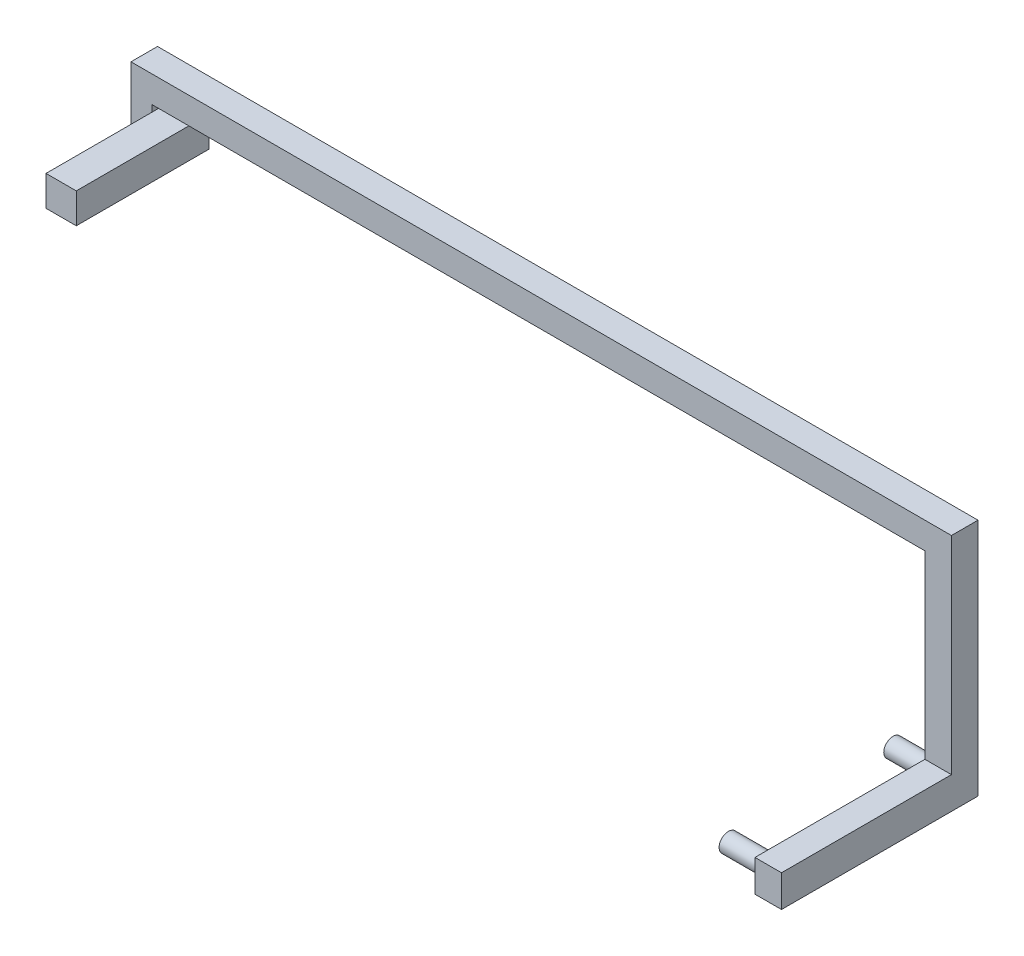
ISO-10303-21;
HEADER;
FILE_DESCRIPTION(('STEP AP214'),'2;1');
FILE_NAME('part.step','',(''),(''),'','','');
FILE_SCHEMA(('AUTOMOTIVE_DESIGN { 1 0 10303 214 1 1 1 1 }'));
ENDSEC;
DATA;
#1=APPLICATION_CONTEXT('core data for automotive mechanical design processes');
#2=APPLICATION_PROTOCOL_DEFINITION('international standard','automotive_design',2000,#1);
#3=PRODUCT_CONTEXT('',#1,'mechanical');
#4=PRODUCT('Part','Part','',(#3));
#5=PRODUCT_RELATED_PRODUCT_CATEGORY('part','',(#4));
#6=PRODUCT_DEFINITION_FORMATION('','',#4);
#7=PRODUCT_DEFINITION_CONTEXT('part definition',#1,'design');
#8=PRODUCT_DEFINITION('design','',#6,#7);
#9=PRODUCT_DEFINITION_SHAPE('','',#8);
#10=(LENGTH_UNIT() NAMED_UNIT(*) SI_UNIT(.MILLI.,.METRE.));
#11=(NAMED_UNIT(*) PLANE_ANGLE_UNIT() SI_UNIT($,.RADIAN.));
#12=(NAMED_UNIT(*) SI_UNIT($,.STERADIAN.) SOLID_ANGLE_UNIT());
#13=UNCERTAINTY_MEASURE_WITH_UNIT(LENGTH_MEASURE(1.E-05),#10,'distance_accuracy_value','');
#14=(GEOMETRIC_REPRESENTATION_CONTEXT(3) GLOBAL_UNCERTAINTY_ASSIGNED_CONTEXT((#13)) GLOBAL_UNIT_ASSIGNED_CONTEXT((#10,
#11,#12)) REPRESENTATION_CONTEXT('',''));
#15=CARTESIAN_POINT('',(0.,0.,0.));
#16=DIRECTION('',(0.,0.,1.));
#17=DIRECTION('',(1.,0.,0.));
#18=AXIS2_PLACEMENT_3D('',#15,#16,#17);
#19=CARTESIAN_POINT('',(0.,0.,5.));
#20=DIRECTION('',(0.,0.,-1.));
#21=DIRECTION('',(-1.,0.,0.));
#22=AXIS2_PLACEMENT_3D('',#19,#20,#21);
#23=PLANE('',#22);
#24=DIRECTION('',(-1.,0.,0.));
#25=VECTOR('',#24,1.);
#26=CARTESIAN_POINT('',(145.5,-27.1,5.));
#27=LINE('',#26,#25);
#28=CARTESIAN_POINT('',(150.5,-27.1,5.));
#29=VERTEX_POINT('',#28);
#30=CARTESIAN_POINT('',(145.5,-27.1,5.));
#31=VERTEX_POINT('',#30);
#32=EDGE_CURVE('E118',#29,#31,#27,.T.);
#33=ORIENTED_EDGE('',*,*,#32,.F.);
#34=DIRECTION('',(0.,1.,0.));
#35=VECTOR('',#34,1.);
#36=CARTESIAN_POINT('',(150.5,6.9,5.));
#37=LINE('',#36,#35);
#38=CARTESIAN_POINT('',(150.5,11.9,5.));
#39=VERTEX_POINT('',#38);
#40=EDGE_CURVE('E112',#29,#39,#37,.T.);
#41=ORIENTED_EDGE('',*,*,#40,.T.);
#42=DIRECTION('',(-1.,0.,0.));
#43=VECTOR('',#42,1.);
#44=CARTESIAN_POINT('',(5.5,11.9,5.));
#45=LINE('',#44,#43);
#46=CARTESIAN_POINT('',(-4.,11.9,5.));
#47=VERTEX_POINT('',#46);
#48=EDGE_CURVE('E115',#39,#47,#45,.T.);
#49=ORIENTED_EDGE('',*,*,#48,.T.);
#50=DIRECTION('',(0.,-1.,0.));
#51=VECTOR('',#50,1.);
#52=CARTESIAN_POINT('',(-4.,0.,5.));
#53=LINE('',#52,#51);
#54=CARTESIAN_POINT('',(-4.,0.,5.));
#55=VERTEX_POINT('',#54);
#56=EDGE_CURVE('E56',#47,#55,#53,.T.);
#57=ORIENTED_EDGE('',*,*,#56,.T.);
#58=DIRECTION('',(1.,0.,0.));
#59=VECTOR('',#58,1.);
#60=CARTESIAN_POINT('',(0.,0.,5.));
#61=LINE('',#60,#59);
#62=CARTESIAN_POINT('',(0.,0.,5.));
#63=VERTEX_POINT('',#62);
#64=EDGE_CURVE('E161',#55,#63,#61,.T.);
#65=ORIENTED_EDGE('',*,*,#64,.T.);
#66=DIRECTION('',(0.,-1.,0.));
#67=VECTOR('',#66,1.);
#68=CARTESIAN_POINT('',(0.,5.7,5.));
#69=LINE('',#68,#67);
#70=CARTESIAN_POINT('',(0.,5.7,5.));
#71=VERTEX_POINT('',#70);
#72=EDGE_CURVE('E102',#71,#63,#69,.T.);
#73=ORIENTED_EDGE('',*,*,#72,.F.);
#74=DIRECTION('',(0.,1.,0.));
#75=VECTOR('',#74,1.);
#76=CARTESIAN_POINT('',(0.,5.7,5.));
#77=LINE('',#76,#75);
#78=CARTESIAN_POINT('',(0.,6.9,5.));
#79=VERTEX_POINT('',#78);
#80=EDGE_CURVE('E216',#71,#79,#77,.T.);
#81=ORIENTED_EDGE('',*,*,#80,.T.);
#82=DIRECTION('',(1.,0.,0.));
#83=VECTOR('',#82,1.);
#84=CARTESIAN_POINT('',(0.,6.9,5.));
#85=LINE('',#84,#83);
#86=CARTESIAN_POINT('',(145.5,6.9,5.));
#87=VERTEX_POINT('',#86);
#88=EDGE_CURVE('E218',#79,#87,#85,.T.);
#89=ORIENTED_EDGE('',*,*,#88,.T.);
#90=DIRECTION('',(0.,-1.,0.));
#91=VECTOR('',#90,1.);
#92=CARTESIAN_POINT('',(145.5,6.9,5.));
#93=LINE('',#92,#91);
#94=EDGE_CURVE('E48',#87,#31,#93,.T.);
#95=ORIENTED_EDGE('',*,*,#94,.T.);
#96=EDGE_LOOP('',(#33,#41,#49,#57,#65,#73,#81,#89,#95));
#97=FACE_BOUND('',#96,.T.);
#98=ADVANCED_FACE('F33',(#97),#23,.F.);
#99=CARTESIAN_POINT('',(0.,0.,5.));
#100=DIRECTION('',(0.,1.,0.));
#101=DIRECTION('',(0.,0.,1.));
#102=AXIS2_PLACEMENT_3D('',#99,#100,#101);
#103=PLANE('',#102);
#104=DIRECTION('',(1.,0.,0.));
#105=VECTOR('',#104,1.);
#106=CARTESIAN_POINT('',(0.,0.,0.));
#107=LINE('',#106,#105);
#108=CARTESIAN_POINT('',(-4.,0.,0.));
#109=VERTEX_POINT('',#108);
#110=CARTESIAN_POINT('',(5.7,0.,0.));
#111=VERTEX_POINT('',#110);
#112=EDGE_CURVE('E95',#109,#111,#107,.T.);
#113=ORIENTED_EDGE('',*,*,#112,.T.);
#114=DIRECTION('',(0.,0.,-1.));
#115=VECTOR('',#114,1.);
#116=CARTESIAN_POINT('',(5.7,0.,5.));
#117=LINE('',#116,#115);
#118=CARTESIAN_POINT('',(5.7,0.,25.));
#119=VERTEX_POINT('',#118);
#120=EDGE_CURVE('E181',#119,#111,#117,.T.);
#121=ORIENTED_EDGE('',*,*,#120,.F.);
#122=DIRECTION('',(-1.,0.,0.));
#123=VECTOR('',#122,1.);
#124=CARTESIAN_POINT('',(5.7,0.,25.));
#125=LINE('',#124,#123);
#126=CARTESIAN_POINT('',(0.,0.,25.));
#127=VERTEX_POINT('',#126);
#128=EDGE_CURVE('E243',#119,#127,#125,.T.);
#129=ORIENTED_EDGE('',*,*,#128,.T.);
#130=DIRECTION('',(0.,0.,-1.));
#131=VECTOR('',#130,1.);
#132=CARTESIAN_POINT('',(0.,0.,25.));
#133=LINE('',#132,#131);
#134=EDGE_CURVE('E215',#127,#63,#133,.T.);
#135=ORIENTED_EDGE('',*,*,#134,.T.);
#136=ORIENTED_EDGE('',*,*,#64,.F.);
#137=DIRECTION('',(0.,0.,-1.));
#138=VECTOR('',#137,1.);
#139=CARTESIAN_POINT('',(-4.,0.,5.));
#140=LINE('',#139,#138);
#141=EDGE_CURVE('E136',#55,#109,#140,.T.);
#142=ORIENTED_EDGE('',*,*,#141,.T.);
#143=EDGE_LOOP('',(#113,#121,#129,#135,#136,#142));
#144=FACE_BOUND('',#143,.T.);
#145=ADVANCED_FACE('F35',(#144),#103,.F.);
#146=CARTESIAN_POINT('',(5.7,0.,5.));
#147=DIRECTION('',(-1.,0.,0.));
#148=DIRECTION('',(0.,0.,1.));
#149=AXIS2_PLACEMENT_3D('',#146,#147,#148);
#150=PLANE('',#149);
#151=DIRECTION('',(0.,1.,0.));
#152=VECTOR('',#151,1.);
#153=CARTESIAN_POINT('',(5.7,0.,0.));
#154=LINE('',#153,#152);
#155=CARTESIAN_POINT('',(5.7,5.7,0.));
#156=VERTEX_POINT('',#155);
#157=EDGE_CURVE('E141',#111,#156,#154,.T.);
#158=ORIENTED_EDGE('',*,*,#157,.T.);
#159=DIRECTION('',(0.,0.,-1.));
#160=VECTOR('',#159,1.);
#161=CARTESIAN_POINT('',(5.7,5.7,5.));
#162=LINE('',#161,#160);
#163=CARTESIAN_POINT('',(5.7,5.7,25.));
#164=VERTEX_POINT('',#163);
#165=EDGE_CURVE('E178',#164,#156,#162,.T.);
#166=ORIENTED_EDGE('',*,*,#165,.F.);
#167=DIRECTION('',(0.,-1.,0.));
#168=VECTOR('',#167,1.);
#169=CARTESIAN_POINT('',(5.7,5.7,25.));
#170=LINE('',#169,#168);
#171=EDGE_CURVE('E251',#164,#119,#170,.T.);
#172=ORIENTED_EDGE('',*,*,#171,.T.);
#173=ORIENTED_EDGE('',*,*,#120,.T.);
#174=EDGE_LOOP('',(#158,#166,#172,#173));
#175=FACE_BOUND('',#174,.T.);
#176=ADVANCED_FACE('F276',(#175),#150,.F.);
#177=CARTESIAN_POINT('',(0.,5.7,5.));
#178=DIRECTION('',(0.,-1.,0.));
#179=DIRECTION('',(0.,0.,-1.));
#180=AXIS2_PLACEMENT_3D('',#177,#178,#179);
#181=PLANE('',#180);
#182=DIRECTION('',(-1.,0.,0.));
#183=VECTOR('',#182,1.);
#184=CARTESIAN_POINT('',(0.,5.7,0.));
#185=LINE('',#184,#183);
#186=CARTESIAN_POINT('',(0.,5.7,0.));
#187=VERTEX_POINT('',#186);
#188=EDGE_CURVE('E144',#156,#187,#185,.T.);
#189=ORIENTED_EDGE('',*,*,#188,.T.);
#190=DIRECTION('',(0.,0.,-1.));
#191=VECTOR('',#190,1.);
#192=CARTESIAN_POINT('',(0.,5.7,5.));
#193=LINE('',#192,#191);
#194=EDGE_CURVE('E175',#71,#187,#193,.T.);
#195=ORIENTED_EDGE('',*,*,#194,.F.);
#196=DIRECTION('',(0.,0.,-1.));
#197=VECTOR('',#196,1.);
#198=CARTESIAN_POINT('',(0.,5.7,25.));
#199=LINE('',#198,#197);
#200=CARTESIAN_POINT('',(0.,5.7,25.));
#201=VERTEX_POINT('',#200);
#202=EDGE_CURVE('E142',#201,#71,#199,.T.);
#203=ORIENTED_EDGE('',*,*,#202,.F.);
#204=DIRECTION('',(-1.,0.,0.));
#205=VECTOR('',#204,1.);
#206=CARTESIAN_POINT('',(5.7,5.7,25.));
#207=LINE('',#206,#205);
#208=EDGE_CURVE('E248',#164,#201,#207,.T.);
#209=ORIENTED_EDGE('',*,*,#208,.F.);
#210=ORIENTED_EDGE('',*,*,#165,.T.);
#211=EDGE_LOOP('',(#189,#195,#203,#209,#210));
#212=FACE_BOUND('',#211,.T.);
#213=ADVANCED_FACE('F262',(#212),#181,.F.);
#214=CARTESIAN_POINT('',(0.,5.7,5.));
#215=DIRECTION('',(-1.,0.,0.));
#216=DIRECTION('',(0.,0.,1.));
#217=AXIS2_PLACEMENT_3D('',#214,#215,#216);
#218=PLANE('',#217);
#219=DIRECTION('',(0.,1.,0.));
#220=VECTOR('',#219,1.);
#221=CARTESIAN_POINT('',(0.,5.7,0.));
#222=LINE('',#221,#220);
#223=CARTESIAN_POINT('',(0.,6.9,0.));
#224=VERTEX_POINT('',#223);
#225=EDGE_CURVE('E146',#187,#224,#222,.T.);
#226=ORIENTED_EDGE('',*,*,#225,.T.);
#227=DIRECTION('',(0.,0.,-1.));
#228=VECTOR('',#227,1.);
#229=CARTESIAN_POINT('',(0.,6.9,5.));
#230=LINE('',#229,#228);
#231=EDGE_CURVE('E172',#79,#224,#230,.T.);
#232=ORIENTED_EDGE('',*,*,#231,.F.);
#233=ORIENTED_EDGE('',*,*,#80,.F.);
#234=ORIENTED_EDGE('',*,*,#194,.T.);
#235=EDGE_LOOP('',(#226,#232,#233,#234));
#236=FACE_BOUND('',#235,.T.);
#237=ADVANCED_FACE('F280',(#236),#218,.F.);
#238=CARTESIAN_POINT('',(5.5,6.9,5.));
#239=DIRECTION('',(0.,1.,0.));
#240=DIRECTION('',(0.,0.,1.));
#241=AXIS2_PLACEMENT_3D('',#238,#239,#240);
#242=PLANE('',#241);
#243=DIRECTION('',(1.,0.,0.));
#244=VECTOR('',#243,1.);
#245=CARTESIAN_POINT('',(5.5,6.9,0.));
#246=LINE('',#245,#244);
#247=CARTESIAN_POINT('',(145.5,6.9,0.));
#248=VERTEX_POINT('',#247);
#249=EDGE_CURVE('E149',#224,#248,#246,.T.);
#250=ORIENTED_EDGE('',*,*,#249,.T.);
#251=DIRECTION('',(0.,0.,-1.));
#252=VECTOR('',#251,1.);
#253=CARTESIAN_POINT('',(145.5,6.9,5.));
#254=LINE('',#253,#252);
#255=EDGE_CURVE('E169',#87,#248,#254,.T.);
#256=ORIENTED_EDGE('',*,*,#255,.F.);
#257=ORIENTED_EDGE('',*,*,#88,.F.);
#258=ORIENTED_EDGE('',*,*,#231,.T.);
#259=EDGE_LOOP('',(#250,#256,#257,#258));
#260=FACE_BOUND('',#259,.T.);
#261=ADVANCED_FACE('F192',(#260),#242,.F.);
#262=CARTESIAN_POINT('',(145.5,6.9,5.));
#263=DIRECTION('',(1.,0.,0.));
#264=DIRECTION('',(0.,0.,-1.));
#265=AXIS2_PLACEMENT_3D('',#262,#263,#264);
#266=PLANE('',#265);
#267=CARTESIAN_POINT('',(145.5,-30.1,34.));
#268=DIRECTION('',(1.,0.,0.));
#269=DIRECTION('',(0.,0.,-1.));
#270=AXIS2_PLACEMENT_3D('',#267,#268,#269);
#271=CIRCLE('',#270,1.75);
#272=CARTESIAN_POINT('',(145.5,-30.1,32.25));
#273=VERTEX_POINT('',#272);
#274=EDGE_CURVE('E11',#273,#273,#271,.F.);
#275=ORIENTED_EDGE('',*,*,#274,.F.);
#276=EDGE_LOOP('',(#275));
#277=FACE_BOUND('',#276,.T.);
#278=CARTESIAN_POINT('',(145.5,-30.1,3.));
#279=DIRECTION('',(1.,0.,0.));
#280=DIRECTION('',(0.,0.,-1.));
#281=AXIS2_PLACEMENT_3D('',#278,#279,#280);
#282=CIRCLE('',#281,1.75);
#283=CARTESIAN_POINT('',(145.5,-30.1,1.25));
#284=VERTEX_POINT('',#283);
#285=EDGE_CURVE('E41',#284,#284,#282,.F.);
#286=ORIENTED_EDGE('',*,*,#285,.F.);
#287=EDGE_LOOP('',(#286));
#288=FACE_BOUND('',#287,.T.);
#289=DIRECTION('',(0.,-1.,0.));
#290=VECTOR('',#289,1.);
#291=CARTESIAN_POINT('',(145.5,6.9,0.));
#292=LINE('',#291,#290);
#293=CARTESIAN_POINT('',(145.5,-33.1,0.));
#294=VERTEX_POINT('',#293);
#295=EDGE_CURVE('E151',#248,#294,#292,.T.);
#296=ORIENTED_EDGE('',*,*,#295,.T.);
#297=DIRECTION('',(0.,0.,-1.));
#298=VECTOR('',#297,1.);
#299=CARTESIAN_POINT('',(145.5,-33.1,5.));
#300=LINE('',#299,#298);
#301=CARTESIAN_POINT('',(145.5,-33.1,37.));
#302=VERTEX_POINT('',#301);
#303=EDGE_CURVE('E166',#302,#294,#300,.T.);
#304=ORIENTED_EDGE('',*,*,#303,.F.);
#305=DIRECTION('',(0.,-1.,0.));
#306=VECTOR('',#305,1.);
#307=CARTESIAN_POINT('',(145.5,-33.1,37.));
#308=LINE('',#307,#306);
#309=CARTESIAN_POINT('',(145.5,-27.1,37.));
#310=VERTEX_POINT('',#309);
#311=EDGE_CURVE('E231',#310,#302,#308,.T.);
#312=ORIENTED_EDGE('',*,*,#311,.F.);
#313=DIRECTION('',(0.,0.,-1.));
#314=VECTOR('',#313,1.);
#315=CARTESIAN_POINT('',(145.5,-27.1,37.));
#316=LINE('',#315,#314);
#317=EDGE_CURVE('E229',#310,#31,#316,.T.);
#318=ORIENTED_EDGE('',*,*,#317,.T.);
#319=ORIENTED_EDGE('',*,*,#94,.F.);
#320=ORIENTED_EDGE('',*,*,#255,.T.);
#321=EDGE_LOOP('',(#296,#304,#312,#318,#319,#320));
#322=FACE_BOUND('',#321,.T.);
#323=ADVANCED_FACE('F188',(#277,#288,#322),#266,.F.);
#324=CARTESIAN_POINT('',(145.5,-33.1,5.));
#325=DIRECTION('',(0.,1.,0.));
#326=DIRECTION('',(0.,0.,1.));
#327=AXIS2_PLACEMENT_3D('',#324,#325,#326);
#328=PLANE('',#327);
#329=DIRECTION('',(1.,0.,0.));
#330=VECTOR('',#329,1.);
#331=CARTESIAN_POINT('',(145.5,-33.1,0.));
#332=LINE('',#331,#330);
#333=CARTESIAN_POINT('',(150.5,-33.1,0.));
#334=VERTEX_POINT('',#333);
#335=EDGE_CURVE('E153',#294,#334,#332,.T.);
#336=ORIENTED_EDGE('',*,*,#335,.T.);
#337=DIRECTION('',(0.,0.,-1.));
#338=VECTOR('',#337,1.);
#339=CARTESIAN_POINT('',(150.5,-33.1,5.));
#340=LINE('',#339,#338);
#341=CARTESIAN_POINT('',(150.5,-33.1,37.));
#342=VERTEX_POINT('',#341);
#343=EDGE_CURVE('E130',#342,#334,#340,.T.);
#344=ORIENTED_EDGE('',*,*,#343,.F.);
#345=DIRECTION('',(1.,0.,0.));
#346=VECTOR('',#345,1.);
#347=CARTESIAN_POINT('',(145.5,-33.1,37.));
#348=LINE('',#347,#346);
#349=EDGE_CURVE('E205',#302,#342,#348,.T.);
#350=ORIENTED_EDGE('',*,*,#349,.F.);
#351=ORIENTED_EDGE('',*,*,#303,.T.);
#352=EDGE_LOOP('',(#336,#344,#350,#351));
#353=FACE_BOUND('',#352,.T.);
#354=ADVANCED_FACE('F191',(#353),#328,.F.);
#355=CARTESIAN_POINT('',(150.5,6.9,5.));
#356=DIRECTION('',(-1.,0.,0.));
#357=DIRECTION('',(0.,0.,1.));
#358=AXIS2_PLACEMENT_3D('',#355,#356,#357);
#359=PLANE('',#358);
#360=DIRECTION('',(0.,1.,0.));
#361=VECTOR('',#360,1.);
#362=CARTESIAN_POINT('',(150.5,6.9,0.));
#363=LINE('',#362,#361);
#364=CARTESIAN_POINT('',(150.5,11.9,0.));
#365=VERTEX_POINT('',#364);
#366=EDGE_CURVE('E128',#334,#365,#363,.T.);
#367=ORIENTED_EDGE('',*,*,#366,.T.);
#368=DIRECTION('',(0.,0.,-1.));
#369=VECTOR('',#368,1.);
#370=CARTESIAN_POINT('',(150.5,11.9,5.));
#371=LINE('',#370,#369);
#372=EDGE_CURVE('E125',#39,#365,#371,.T.);
#373=ORIENTED_EDGE('',*,*,#372,.F.);
#374=ORIENTED_EDGE('',*,*,#40,.F.);
#375=DIRECTION('',(0.,0.,-1.));
#376=VECTOR('',#375,1.);
#377=CARTESIAN_POINT('',(150.5,-27.1,37.));
#378=LINE('',#377,#376);
#379=CARTESIAN_POINT('',(150.5,-27.1,37.));
#380=VERTEX_POINT('',#379);
#381=EDGE_CURVE('E234',#380,#29,#378,.T.);
#382=ORIENTED_EDGE('',*,*,#381,.F.);
#383=DIRECTION('',(0.,1.,0.));
#384=VECTOR('',#383,1.);
#385=CARTESIAN_POINT('',(150.5,-33.1,37.));
#386=LINE('',#385,#384);
#387=EDGE_CURVE('E239',#342,#380,#386,.T.);
#388=ORIENTED_EDGE('',*,*,#387,.F.);
#389=ORIENTED_EDGE('',*,*,#343,.T.);
#390=EDGE_LOOP('',(#367,#373,#374,#382,#388,#389));
#391=FACE_BOUND('',#390,.T.);
#392=ADVANCED_FACE('F126',(#391),#359,.F.);
#393=CARTESIAN_POINT('',(-4.,11.9,5.));
#394=DIRECTION('',(0.,-1.,0.));
#395=DIRECTION('',(0.,0.,-1.));
#396=AXIS2_PLACEMENT_3D('',#393,#394,#395);
#397=PLANE('',#396);
#398=DIRECTION('',(-1.,0.,0.));
#399=VECTOR('',#398,1.);
#400=CARTESIAN_POINT('',(-4.,11.9,0.));
#401=LINE('',#400,#399);
#402=CARTESIAN_POINT('',(-4.,11.9,0.));
#403=VERTEX_POINT('',#402);
#404=EDGE_CURVE('E157',#365,#403,#401,.T.);
#405=ORIENTED_EDGE('',*,*,#404,.T.);
#406=DIRECTION('',(0.,0.,-1.));
#407=VECTOR('',#406,1.);
#408=CARTESIAN_POINT('',(-4.,11.9,5.));
#409=LINE('',#408,#407);
#410=EDGE_CURVE('E131',#47,#403,#409,.T.);
#411=ORIENTED_EDGE('',*,*,#410,.F.);
#412=ORIENTED_EDGE('',*,*,#48,.F.);
#413=ORIENTED_EDGE('',*,*,#372,.T.);
#414=EDGE_LOOP('',(#405,#411,#412,#413));
#415=FACE_BOUND('',#414,.T.);
#416=ADVANCED_FACE('F133',(#415),#397,.F.);
#417=CARTESIAN_POINT('',(-4.,0.,5.));
#418=DIRECTION('',(1.,0.,0.));
#419=DIRECTION('',(0.,0.,-1.));
#420=AXIS2_PLACEMENT_3D('',#417,#418,#419);
#421=PLANE('',#420);
#422=DIRECTION('',(0.,-1.,0.));
#423=VECTOR('',#422,1.);
#424=CARTESIAN_POINT('',(-4.,0.,0.));
#425=LINE('',#424,#423);
#426=EDGE_CURVE('E159',#403,#109,#425,.T.);
#427=ORIENTED_EDGE('',*,*,#426,.T.);
#428=ORIENTED_EDGE('',*,*,#141,.F.);
#429=ORIENTED_EDGE('',*,*,#56,.F.);
#430=ORIENTED_EDGE('',*,*,#410,.T.);
#431=EDGE_LOOP('',(#427,#428,#429,#430));
#432=FACE_BOUND('',#431,.T.);
#433=ADVANCED_FACE('F209',(#432),#421,.F.);
#434=CARTESIAN_POINT('',(0.,0.,0.));
#435=DIRECTION('',(0.,0.,-1.));
#436=DIRECTION('',(-1.,0.,0.));
#437=AXIS2_PLACEMENT_3D('',#434,#435,#436);
#438=PLANE('',#437);
#439=ORIENTED_EDGE('',*,*,#112,.F.);
#440=ORIENTED_EDGE('',*,*,#426,.F.);
#441=ORIENTED_EDGE('',*,*,#404,.F.);
#442=ORIENTED_EDGE('',*,*,#366,.F.);
#443=ORIENTED_EDGE('',*,*,#335,.F.);
#444=ORIENTED_EDGE('',*,*,#295,.F.);
#445=ORIENTED_EDGE('',*,*,#249,.F.);
#446=ORIENTED_EDGE('',*,*,#225,.F.);
#447=ORIENTED_EDGE('',*,*,#188,.F.);
#448=ORIENTED_EDGE('',*,*,#157,.F.);
#449=EDGE_LOOP('',(#439,#440,#441,#442,#443,#444,#445,#446,#447,#448));
#450=FACE_BOUND('',#449,.T.);
#451=ADVANCED_FACE('F207',(#450),#438,.T.);
#452=CARTESIAN_POINT('',(0.,5.7,25.));
#453=DIRECTION('',(1.,0.,0.));
#454=DIRECTION('',(0.,0.,-1.));
#455=AXIS2_PLACEMENT_3D('',#452,#453,#454);
#456=PLANE('',#455);
#457=ORIENTED_EDGE('',*,*,#72,.T.);
#458=ORIENTED_EDGE('',*,*,#134,.F.);
#459=DIRECTION('',(0.,-1.,0.));
#460=VECTOR('',#459,1.);
#461=CARTESIAN_POINT('',(0.,5.7,25.));
#462=LINE('',#461,#460);
#463=EDGE_CURVE('E245',#201,#127,#462,.T.);
#464=ORIENTED_EDGE('',*,*,#463,.F.);
#465=ORIENTED_EDGE('',*,*,#202,.T.);
#466=EDGE_LOOP('',(#457,#458,#464,#465));
#467=FACE_BOUND('',#466,.T.);
#468=ADVANCED_FACE('F258',(#467),#456,.F.);
#469=CARTESIAN_POINT('',(0.,0.,25.));
#470=DIRECTION('',(0.,0.,1.));
#471=DIRECTION('',(1.,0.,0.));
#472=AXIS2_PLACEMENT_3D('',#469,#470,#471);
#473=PLANE('',#472);
#474=ORIENTED_EDGE('',*,*,#128,.F.);
#475=ORIENTED_EDGE('',*,*,#171,.F.);
#476=ORIENTED_EDGE('',*,*,#208,.T.);
#477=ORIENTED_EDGE('',*,*,#463,.T.);
#478=EDGE_LOOP('',(#474,#475,#476,#477));
#479=FACE_BOUND('',#478,.T.);
#480=ADVANCED_FACE('F275',(#479),#473,.T.);
#481=CARTESIAN_POINT('',(145.5,-27.1,37.));
#482=DIRECTION('',(0.,-1.,0.));
#483=DIRECTION('',(0.,0.,-1.));
#484=AXIS2_PLACEMENT_3D('',#481,#482,#483);
#485=PLANE('',#484);
#486=ORIENTED_EDGE('',*,*,#32,.T.);
#487=ORIENTED_EDGE('',*,*,#317,.F.);
#488=DIRECTION('',(-1.,0.,0.));
#489=VECTOR('',#488,1.);
#490=CARTESIAN_POINT('',(145.5,-27.1,37.));
#491=LINE('',#490,#489);
#492=EDGE_CURVE('E235',#380,#310,#491,.T.);
#493=ORIENTED_EDGE('',*,*,#492,.F.);
#494=ORIENTED_EDGE('',*,*,#381,.T.);
#495=EDGE_LOOP('',(#486,#487,#493,#494));
#496=FACE_BOUND('',#495,.T.);
#497=ADVANCED_FACE('F340',(#496),#485,.F.);
#498=CARTESIAN_POINT('',(0.,0.,37.));
#499=DIRECTION('',(0.,0.,-1.));
#500=DIRECTION('',(-1.,0.,0.));
#501=AXIS2_PLACEMENT_3D('',#498,#499,#500);
#502=PLANE('',#501);
#503=ORIENTED_EDGE('',*,*,#311,.T.);
#504=ORIENTED_EDGE('',*,*,#349,.T.);
#505=ORIENTED_EDGE('',*,*,#387,.T.);
#506=ORIENTED_EDGE('',*,*,#492,.T.);
#507=EDGE_LOOP('',(#503,#504,#505,#506));
#508=FACE_BOUND('',#507,.T.);
#509=ADVANCED_FACE('F345',(#508),#502,.F.);
#510=CARTESIAN_POINT('',(137.5,-30.1,3.));
#511=DIRECTION('',(1.,0.,0.));
#512=DIRECTION('',(0.,0.,-1.));
#513=AXIS2_PLACEMENT_3D('',#510,#511,#512);
#514=CYLINDRICAL_SURFACE('',#513,1.75);
#515=CARTESIAN_POINT('',(137.5,-30.1,3.));
#516=DIRECTION('',(-1.,0.,0.));
#517=DIRECTION('',(0.,0.,1.));
#518=AXIS2_PLACEMENT_3D('',#515,#516,#517);
#519=CIRCLE('',#518,1.75);
#520=CARTESIAN_POINT('',(137.5,-30.1,4.75000000000001));
#521=VERTEX_POINT('',#520);
#522=EDGE_CURVE('E480',#521,#521,#519,.T.);
#523=ORIENTED_EDGE('',*,*,#522,.F.);
#524=EDGE_LOOP('',(#523));
#525=FACE_BOUND('',#524,.T.);
#526=ORIENTED_EDGE('',*,*,#285,.T.);
#527=EDGE_LOOP('',(#526));
#528=FACE_BOUND('',#527,.T.);
#529=ADVANCED_FACE('F186',(#525,#528),#514,.T.);
#530=CARTESIAN_POINT('',(137.5,-30.1,3.));
#531=DIRECTION('',(-1.,0.,0.));
#532=DIRECTION('',(0.,0.,1.));
#533=AXIS2_PLACEMENT_3D('',#530,#531,#532);
#534=PLANE('',#533);
#535=ORIENTED_EDGE('',*,*,#522,.T.);
#536=EDGE_LOOP('',(#535));
#537=FACE_BOUND('',#536,.T.);
#538=ADVANCED_FACE('F359',(#537),#534,.T.);
#539=CARTESIAN_POINT('',(137.5,-30.1,34.));
#540=DIRECTION('',(1.,0.,0.));
#541=DIRECTION('',(0.,0.,-1.));
#542=AXIS2_PLACEMENT_3D('',#539,#540,#541);
#543=CYLINDRICAL_SURFACE('',#542,1.75);
#544=CARTESIAN_POINT('',(137.5,-30.1,34.));
#545=DIRECTION('',(-1.,0.,0.));
#546=DIRECTION('',(0.,0.,1.));
#547=AXIS2_PLACEMENT_3D('',#544,#545,#546);
#548=CIRCLE('',#547,1.75);
#549=CARTESIAN_POINT('',(137.5,-30.1,35.75));
#550=VERTEX_POINT('',#549);
#551=EDGE_CURVE('E479',#550,#550,#548,.T.);
#552=ORIENTED_EDGE('',*,*,#551,.F.);
#553=EDGE_LOOP('',(#552));
#554=FACE_BOUND('',#553,.T.);
#555=ORIENTED_EDGE('',*,*,#274,.T.);
#556=EDGE_LOOP('',(#555));
#557=FACE_BOUND('',#556,.T.);
#558=ADVANCED_FACE('F367',(#554,#557),#543,.T.);
#559=CARTESIAN_POINT('',(137.5,-30.1,34.));
#560=DIRECTION('',(-1.,0.,0.));
#561=DIRECTION('',(0.,0.,1.));
#562=AXIS2_PLACEMENT_3D('',#559,#560,#561);
#563=PLANE('',#562);
#564=ORIENTED_EDGE('',*,*,#551,.T.);
#565=EDGE_LOOP('',(#564));
#566=FACE_BOUND('',#565,.T.);
#567=ADVANCED_FACE('F375',(#566),#563,.T.);
#568=CLOSED_SHELL('',(#98,#145,#176,#213,#237,#261,#323,#354,#392,#416,#433,#451,#468,#480,#497,
#509,#529,#538,#558,#567));
#569=MANIFOLD_SOLID_BREP('B2',#568);
#570=ADVANCED_BREP_SHAPE_REPRESENTATION('',(#18,#569),#14);
#571=SHAPE_DEFINITION_REPRESENTATION(#9,#570);
ENDSEC;
END-ISO-10303-21;
